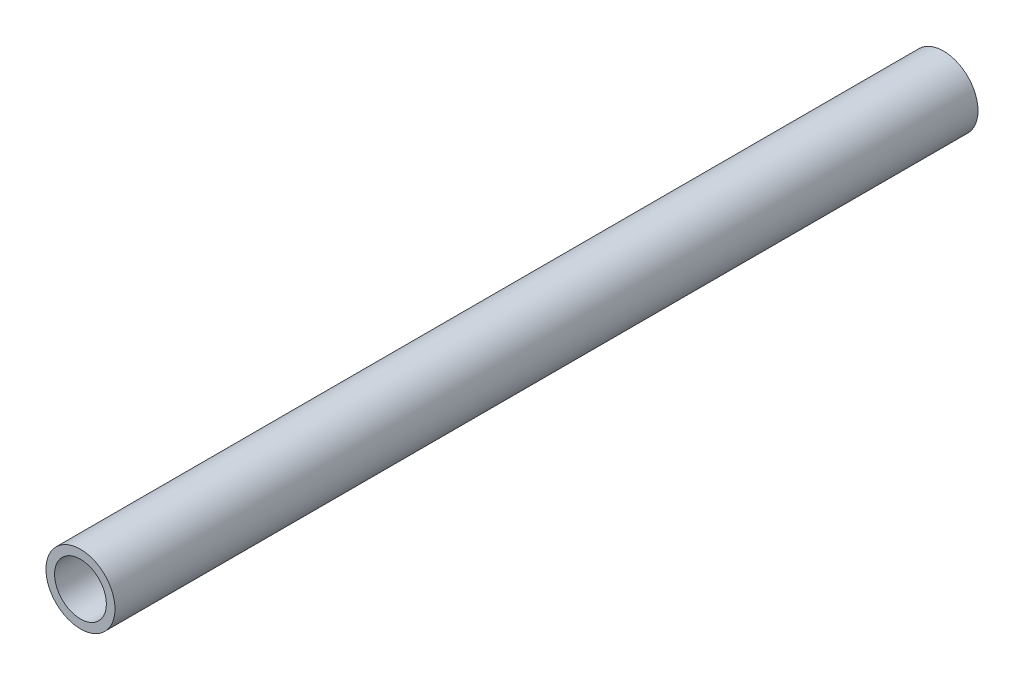
ISO-10303-21;
HEADER;
FILE_DESCRIPTION(('STEP AP214'),'2;1');
FILE_NAME('part.step','',(''),(''),'','','');
FILE_SCHEMA(('AUTOMOTIVE_DESIGN { 1 0 10303 214 1 1 1 1 }'));
ENDSEC;
DATA;
#1=APPLICATION_CONTEXT('core data for automotive mechanical design processes');
#2=APPLICATION_PROTOCOL_DEFINITION('international standard','automotive_design',2000,#1);
#3=PRODUCT_CONTEXT('',#1,'mechanical');
#4=PRODUCT('Part','Part','',(#3));
#5=PRODUCT_RELATED_PRODUCT_CATEGORY('part','',(#4));
#6=PRODUCT_DEFINITION_FORMATION('','',#4);
#7=PRODUCT_DEFINITION_CONTEXT('part definition',#1,'design');
#8=PRODUCT_DEFINITION('design','',#6,#7);
#9=PRODUCT_DEFINITION_SHAPE('','',#8);
#10=(LENGTH_UNIT() NAMED_UNIT(*) SI_UNIT(.MILLI.,.METRE.));
#11=(NAMED_UNIT(*) PLANE_ANGLE_UNIT() SI_UNIT($,.RADIAN.));
#12=(NAMED_UNIT(*) SI_UNIT($,.STERADIAN.) SOLID_ANGLE_UNIT());
#13=UNCERTAINTY_MEASURE_WITH_UNIT(LENGTH_MEASURE(1.E-05),#10,'distance_accuracy_value','');
#14=(GEOMETRIC_REPRESENTATION_CONTEXT(3) GLOBAL_UNCERTAINTY_ASSIGNED_CONTEXT((#13)) GLOBAL_UNIT_ASSIGNED_CONTEXT((#10,
#11,#12)) REPRESENTATION_CONTEXT('',''));
#15=CARTESIAN_POINT('',(0.,0.,0.));
#16=DIRECTION('',(0.,0.,1.));
#17=DIRECTION('',(1.,0.,0.));
#18=AXIS2_PLACEMENT_3D('',#15,#16,#17);
#19=CARTESIAN_POINT('',(0.,0.,100.));
#20=DIRECTION('',(0.,0.,1.));
#21=DIRECTION('',(1.,0.,0.));
#22=AXIS2_PLACEMENT_3D('',#19,#20,#21);
#23=PLANE('',#22);
#24=CARTESIAN_POINT('',(0.,0.,100.));
#25=DIRECTION('',(0.,0.,1.));
#26=DIRECTION('',(1.,0.,0.));
#27=AXIS2_PLACEMENT_3D('',#24,#25,#26);
#28=CIRCLE('',#27,4.);
#29=CARTESIAN_POINT('',(4.,0.,100.));
#30=VERTEX_POINT('',#29);
#31=EDGE_CURVE('E10',#30,#30,#28,.T.);
#32=ORIENTED_EDGE('',*,*,#31,.T.);
#33=EDGE_LOOP('',(#32));
#34=FACE_BOUND('',#33,.T.);
#35=CARTESIAN_POINT('',(0.,0.,100.));
#36=DIRECTION('',(0.,0.,1.));
#37=DIRECTION('',(1.,0.,0.));
#38=AXIS2_PLACEMENT_3D('',#35,#36,#37);
#39=CIRCLE('',#38,3.);
#40=CARTESIAN_POINT('',(3.,0.,100.));
#41=VERTEX_POINT('',#40);
#42=EDGE_CURVE('E49',#41,#41,#39,.T.);
#43=ORIENTED_EDGE('',*,*,#42,.F.);
#44=EDGE_LOOP('',(#43));
#45=FACE_BOUND('',#44,.T.);
#46=ADVANCED_FACE('F38',(#34,#45),#23,.T.);
#47=CARTESIAN_POINT('',(0.,0.,0.));
#48=DIRECTION('',(0.,0.,1.));
#49=DIRECTION('',(1.,0.,0.));
#50=AXIS2_PLACEMENT_3D('',#47,#48,#49);
#51=PLANE('',#50);
#52=CARTESIAN_POINT('',(0.,0.,0.));
#53=DIRECTION('',(0.,0.,1.));
#54=DIRECTION('',(1.,0.,0.));
#55=AXIS2_PLACEMENT_3D('',#52,#53,#54);
#56=CIRCLE('',#55,4.);
#57=CARTESIAN_POINT('',(4.,0.,0.));
#58=VERTEX_POINT('',#57);
#59=EDGE_CURVE('E42',#58,#58,#56,.T.);
#60=ORIENTED_EDGE('',*,*,#59,.F.);
#61=EDGE_LOOP('',(#60));
#62=FACE_BOUND('',#61,.T.);
#63=CARTESIAN_POINT('',(0.,0.,0.));
#64=DIRECTION('',(0.,0.,1.));
#65=DIRECTION('',(1.,0.,0.));
#66=AXIS2_PLACEMENT_3D('',#63,#64,#65);
#67=CIRCLE('',#66,3.);
#68=CARTESIAN_POINT('',(3.,0.,0.));
#69=VERTEX_POINT('',#68);
#70=EDGE_CURVE('E51',#69,#69,#67,.T.);
#71=ORIENTED_EDGE('',*,*,#70,.T.);
#72=EDGE_LOOP('',(#71));
#73=FACE_BOUND('',#72,.T.);
#74=ADVANCED_FACE('F61',(#62,#73),#51,.F.);
#75=CARTESIAN_POINT('',(0.,0.,100.));
#76=DIRECTION('',(0.,0.,-1.));
#77=DIRECTION('',(-1.,0.,0.));
#78=AXIS2_PLACEMENT_3D('',#75,#76,#77);
#79=CYLINDRICAL_SURFACE('',#78,4.);
#80=ORIENTED_EDGE('',*,*,#31,.F.);
#81=EDGE_LOOP('',(#80));
#82=FACE_BOUND('',#81,.T.);
#83=ORIENTED_EDGE('',*,*,#59,.T.);
#84=EDGE_LOOP('',(#83));
#85=FACE_BOUND('',#84,.T.);
#86=ADVANCED_FACE('F40',(#82,#85),#79,.T.);
#87=CARTESIAN_POINT('',(0.,0.,100.));
#88=DIRECTION('',(0.,0.,-1.));
#89=DIRECTION('',(-1.,0.,0.));
#90=AXIS2_PLACEMENT_3D('',#87,#88,#89);
#91=CYLINDRICAL_SURFACE('',#90,3.);
#92=ORIENTED_EDGE('',*,*,#42,.T.);
#93=EDGE_LOOP('',(#92));
#94=FACE_BOUND('',#93,.T.);
#95=ORIENTED_EDGE('',*,*,#70,.F.);
#96=EDGE_LOOP('',(#95));
#97=FACE_BOUND('',#96,.T.);
#98=ADVANCED_FACE('F57',(#94,#97),#91,.F.);
#99=CLOSED_SHELL('',(#46,#74,#86,#98));
#100=MANIFOLD_SOLID_BREP('B2',#99);
#101=ADVANCED_BREP_SHAPE_REPRESENTATION('',(#18,#100),#14);
#102=SHAPE_DEFINITION_REPRESENTATION(#9,#101);
ENDSEC;
END-ISO-10303-21;
